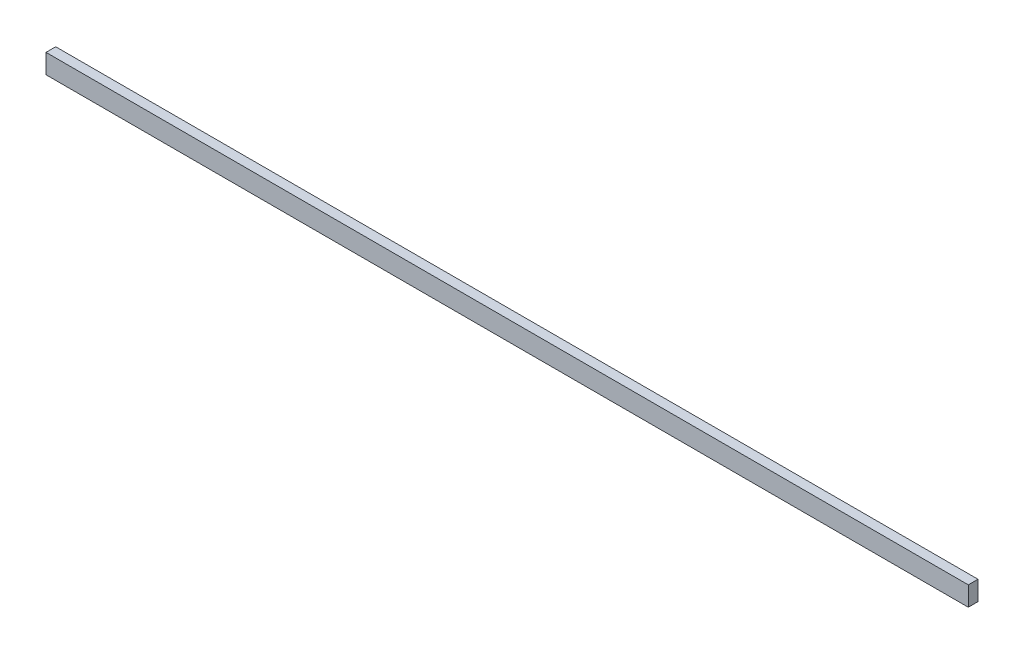
ISO-10303-21;
HEADER;
FILE_DESCRIPTION(('STEP AP214'),'2;1');
FILE_NAME('part.step','',(''),(''),'','','');
FILE_SCHEMA(('AUTOMOTIVE_DESIGN { 1 0 10303 214 1 1 1 1 }'));
ENDSEC;
DATA;
#1=APPLICATION_CONTEXT('core data for automotive mechanical design processes');
#2=APPLICATION_PROTOCOL_DEFINITION('international standard','automotive_design',2000,#1);
#3=PRODUCT_CONTEXT('',#1,'mechanical');
#4=PRODUCT('Part','Part','',(#3));
#5=PRODUCT_RELATED_PRODUCT_CATEGORY('part','',(#4));
#6=PRODUCT_DEFINITION_FORMATION('','',#4);
#7=PRODUCT_DEFINITION_CONTEXT('part definition',#1,'design');
#8=PRODUCT_DEFINITION('design','',#6,#7);
#9=PRODUCT_DEFINITION_SHAPE('','',#8);
#10=(LENGTH_UNIT() NAMED_UNIT(*) SI_UNIT(.MILLI.,.METRE.));
#11=(NAMED_UNIT(*) PLANE_ANGLE_UNIT() SI_UNIT($,.RADIAN.));
#12=(NAMED_UNIT(*) SI_UNIT($,.STERADIAN.) SOLID_ANGLE_UNIT());
#13=UNCERTAINTY_MEASURE_WITH_UNIT(LENGTH_MEASURE(1.E-05),#10,'distance_accuracy_value','');
#14=(GEOMETRIC_REPRESENTATION_CONTEXT(3) GLOBAL_UNCERTAINTY_ASSIGNED_CONTEXT((#13)) GLOBAL_UNIT_ASSIGNED_CONTEXT((#10,
#11,#12)) REPRESENTATION_CONTEXT('',''));
#15=CARTESIAN_POINT('',(0.,0.,0.));
#16=DIRECTION('',(0.,0.,1.));
#17=DIRECTION('',(1.,0.,0.));
#18=AXIS2_PLACEMENT_3D('',#15,#16,#17);
#19=CARTESIAN_POINT('',(95.,2.,2.));
#20=DIRECTION('',(-1.,0.,0.));
#21=DIRECTION('',(0.,0.,1.));
#22=AXIS2_PLACEMENT_3D('',#19,#20,#21);
#23=PLANE('',#22);
#24=DIRECTION('',(0.,1.,0.));
#25=VECTOR('',#24,1.);
#26=CARTESIAN_POINT('',(95.,2.,0.));
#27=LINE('',#26,#25);
#28=CARTESIAN_POINT('',(95.,-2.,0.));
#29=VERTEX_POINT('',#28);
#30=CARTESIAN_POINT('',(95.,2.,0.));
#31=VERTEX_POINT('',#30);
#32=EDGE_CURVE('E96',#29,#31,#27,.T.);
#33=ORIENTED_EDGE('',*,*,#32,.T.);
#34=DIRECTION('',(0.,0.,-1.));
#35=VECTOR('',#34,1.);
#36=CARTESIAN_POINT('',(95.,2.,2.));
#37=LINE('',#36,#35);
#38=CARTESIAN_POINT('',(95.,2.,2.));
#39=VERTEX_POINT('',#38);
#40=EDGE_CURVE('E11',#39,#31,#37,.T.);
#41=ORIENTED_EDGE('',*,*,#40,.F.);
#42=DIRECTION('',(0.,1.,0.));
#43=VECTOR('',#42,1.);
#44=CARTESIAN_POINT('',(95.,2.,2.));
#45=LINE('',#44,#43);
#46=CARTESIAN_POINT('',(95.,-2.,2.));
#47=VERTEX_POINT('',#46);
#48=EDGE_CURVE('E84',#47,#39,#45,.T.);
#49=ORIENTED_EDGE('',*,*,#48,.F.);
#50=DIRECTION('',(0.,0.,-1.));
#51=VECTOR('',#50,1.);
#52=CARTESIAN_POINT('',(95.,-2.,2.));
#53=LINE('',#52,#51);
#54=EDGE_CURVE('E92',#47,#29,#53,.T.);
#55=ORIENTED_EDGE('',*,*,#54,.T.);
#56=EDGE_LOOP('',(#33,#41,#49,#55));
#57=FACE_BOUND('',#56,.T.);
#58=ADVANCED_FACE('F33',(#57),#23,.F.);
#59=CARTESIAN_POINT('',(-95.,2.,2.));
#60=DIRECTION('',(0.,-1.,0.));
#61=DIRECTION('',(0.,0.,-1.));
#62=AXIS2_PLACEMENT_3D('',#59,#60,#61);
#63=PLANE('',#62);
#64=DIRECTION('',(-1.,0.,0.));
#65=VECTOR('',#64,1.);
#66=CARTESIAN_POINT('',(-95.,2.,0.));
#67=LINE('',#66,#65);
#68=CARTESIAN_POINT('',(-95.,2.,0.));
#69=VERTEX_POINT('',#68);
#70=EDGE_CURVE('E88',#31,#69,#67,.T.);
#71=ORIENTED_EDGE('',*,*,#70,.T.);
#72=DIRECTION('',(0.,0.,-1.));
#73=VECTOR('',#72,1.);
#74=CARTESIAN_POINT('',(-95.,2.,2.));
#75=LINE('',#74,#73);
#76=CARTESIAN_POINT('',(-95.,2.,2.));
#77=VERTEX_POINT('',#76);
#78=EDGE_CURVE('E41',#77,#69,#75,.T.);
#79=ORIENTED_EDGE('',*,*,#78,.F.);
#80=DIRECTION('',(-1.,0.,0.));
#81=VECTOR('',#80,1.);
#82=CARTESIAN_POINT('',(-95.,2.,2.));
#83=LINE('',#82,#81);
#84=EDGE_CURVE('E79',#39,#77,#83,.T.);
#85=ORIENTED_EDGE('',*,*,#84,.F.);
#86=ORIENTED_EDGE('',*,*,#40,.T.);
#87=EDGE_LOOP('',(#71,#79,#85,#86));
#88=FACE_BOUND('',#87,.T.);
#89=ADVANCED_FACE('F87',(#88),#63,.F.);
#90=CARTESIAN_POINT('',(-95.,2.,2.));
#91=DIRECTION('',(1.,0.,0.));
#92=DIRECTION('',(0.,0.,-1.));
#93=AXIS2_PLACEMENT_3D('',#90,#91,#92);
#94=PLANE('',#93);
#95=DIRECTION('',(0.,-1.,0.));
#96=VECTOR('',#95,1.);
#97=CARTESIAN_POINT('',(-95.,2.,0.));
#98=LINE('',#97,#96);
#99=CARTESIAN_POINT('',(-95.,-2.,0.));
#100=VERTEX_POINT('',#99);
#101=EDGE_CURVE('E66',#69,#100,#98,.T.);
#102=ORIENTED_EDGE('',*,*,#101,.T.);
#103=DIRECTION('',(0.,0.,-1.));
#104=VECTOR('',#103,1.);
#105=CARTESIAN_POINT('',(-95.,-2.,2.));
#106=LINE('',#105,#104);
#107=CARTESIAN_POINT('',(-95.,-2.,2.));
#108=VERTEX_POINT('',#107);
#109=EDGE_CURVE('E89',#108,#100,#106,.T.);
#110=ORIENTED_EDGE('',*,*,#109,.F.);
#111=DIRECTION('',(0.,-1.,0.));
#112=VECTOR('',#111,1.);
#113=CARTESIAN_POINT('',(-95.,2.,2.));
#114=LINE('',#113,#112);
#115=EDGE_CURVE('E82',#77,#108,#114,.T.);
#116=ORIENTED_EDGE('',*,*,#115,.F.);
#117=ORIENTED_EDGE('',*,*,#78,.T.);
#118=EDGE_LOOP('',(#102,#110,#116,#117));
#119=FACE_BOUND('',#118,.T.);
#120=ADVANCED_FACE('F90',(#119),#94,.F.);
#121=CARTESIAN_POINT('',(-95.,-2.,2.));
#122=DIRECTION('',(0.,1.,0.));
#123=DIRECTION('',(0.,0.,1.));
#124=AXIS2_PLACEMENT_3D('',#121,#122,#123);
#125=PLANE('',#124);
#126=DIRECTION('',(1.,0.,0.));
#127=VECTOR('',#126,1.);
#128=CARTESIAN_POINT('',(-95.,-2.,0.));
#129=LINE('',#128,#127);
#130=EDGE_CURVE('E72',#100,#29,#129,.T.);
#131=ORIENTED_EDGE('',*,*,#130,.T.);
#132=ORIENTED_EDGE('',*,*,#54,.F.);
#133=DIRECTION('',(1.,0.,0.));
#134=VECTOR('',#133,1.);
#135=CARTESIAN_POINT('',(-95.,-2.,2.));
#136=LINE('',#135,#134);
#137=EDGE_CURVE('E49',#108,#47,#136,.T.);
#138=ORIENTED_EDGE('',*,*,#137,.F.);
#139=ORIENTED_EDGE('',*,*,#109,.T.);
#140=EDGE_LOOP('',(#131,#132,#138,#139));
#141=FACE_BOUND('',#140,.T.);
#142=ADVANCED_FACE('F103',(#141),#125,.F.);
#143=CARTESIAN_POINT('',(0.,0.,2.));
#144=DIRECTION('',(0.,0.,1.));
#145=DIRECTION('',(1.,0.,0.));
#146=AXIS2_PLACEMENT_3D('',#143,#144,#145);
#147=PLANE('',#146);
#148=ORIENTED_EDGE('',*,*,#48,.T.);
#149=ORIENTED_EDGE('',*,*,#84,.T.);
#150=ORIENTED_EDGE('',*,*,#115,.T.);
#151=ORIENTED_EDGE('',*,*,#137,.T.);
#152=EDGE_LOOP('',(#148,#149,#150,#151));
#153=FACE_BOUND('',#152,.T.);
#154=ADVANCED_FACE('F80',(#153),#147,.T.);
#155=CARTESIAN_POINT('',(0.,0.,0.));
#156=DIRECTION('',(0.,0.,1.));
#157=DIRECTION('',(1.,0.,0.));
#158=AXIS2_PLACEMENT_3D('',#155,#156,#157);
#159=PLANE('',#158);
#160=ORIENTED_EDGE('',*,*,#32,.F.);
#161=ORIENTED_EDGE('',*,*,#130,.F.);
#162=ORIENTED_EDGE('',*,*,#101,.F.);
#163=ORIENTED_EDGE('',*,*,#70,.F.);
#164=EDGE_LOOP('',(#160,#161,#162,#163));
#165=FACE_BOUND('',#164,.T.);
#166=ADVANCED_FACE('F106',(#165),#159,.F.);
#167=CLOSED_SHELL('',(#58,#89,#120,#142,#154,#166));
#168=MANIFOLD_SOLID_BREP('B2',#167);
#169=ADVANCED_BREP_SHAPE_REPRESENTATION('',(#18,#168),#14);
#170=SHAPE_DEFINITION_REPRESENTATION(#9,#169);
ENDSEC;
END-ISO-10303-21;
